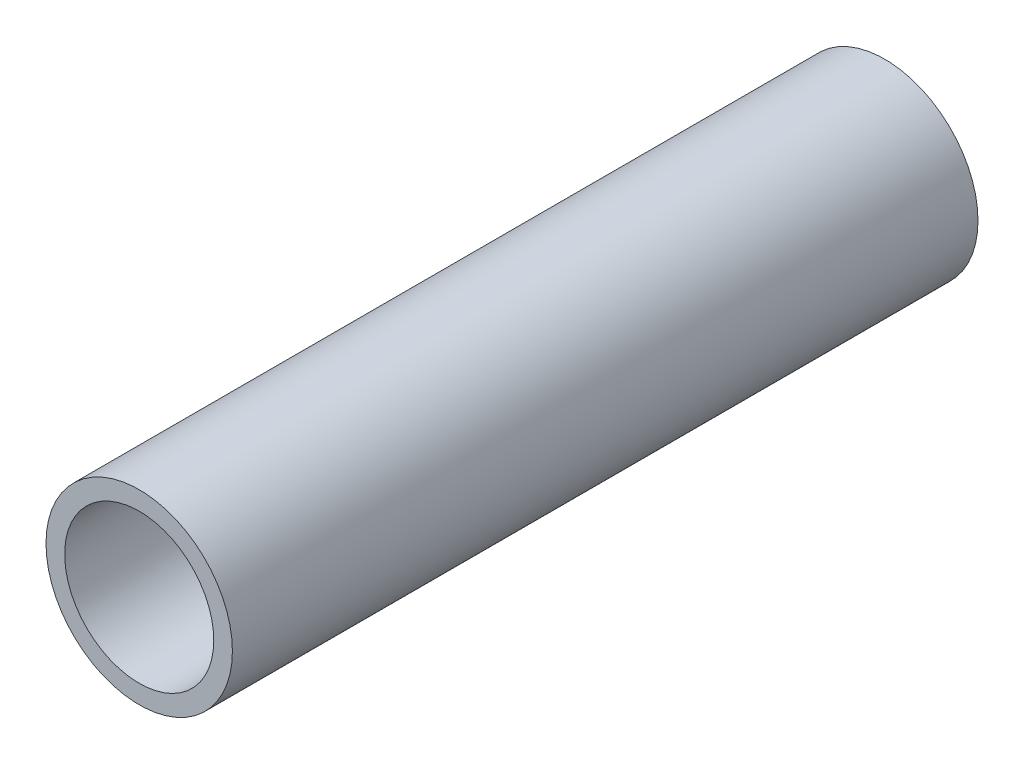
ISO-10303-21;
HEADER;
FILE_DESCRIPTION(('STEP AP214'),'2;1');
FILE_NAME('part.step','',(''),(''),'','','');
FILE_SCHEMA(('AUTOMOTIVE_DESIGN { 1 0 10303 214 1 1 1 1 }'));
ENDSEC;
DATA;
#1=APPLICATION_CONTEXT('core data for automotive mechanical design processes');
#2=APPLICATION_PROTOCOL_DEFINITION('international standard','automotive_design',2000,#1);
#3=PRODUCT_CONTEXT('',#1,'mechanical');
#4=PRODUCT('Part','Part','',(#3));
#5=PRODUCT_RELATED_PRODUCT_CATEGORY('part','',(#4));
#6=PRODUCT_DEFINITION_FORMATION('','',#4);
#7=PRODUCT_DEFINITION_CONTEXT('part definition',#1,'design');
#8=PRODUCT_DEFINITION('design','',#6,#7);
#9=PRODUCT_DEFINITION_SHAPE('','',#8);
#10=(LENGTH_UNIT() NAMED_UNIT(*) SI_UNIT(.MILLI.,.METRE.));
#11=(NAMED_UNIT(*) PLANE_ANGLE_UNIT() SI_UNIT($,.RADIAN.));
#12=(NAMED_UNIT(*) SI_UNIT($,.STERADIAN.) SOLID_ANGLE_UNIT());
#13=UNCERTAINTY_MEASURE_WITH_UNIT(LENGTH_MEASURE(1.E-05),#10,'distance_accuracy_value','');
#14=(GEOMETRIC_REPRESENTATION_CONTEXT(3) GLOBAL_UNCERTAINTY_ASSIGNED_CONTEXT((#13)) GLOBAL_UNIT_ASSIGNED_CONTEXT((#10,
#11,#12)) REPRESENTATION_CONTEXT('',''));
#15=CARTESIAN_POINT('',(0.,0.,0.));
#16=DIRECTION('',(0.,0.,1.));
#17=DIRECTION('',(1.,0.,0.));
#18=AXIS2_PLACEMENT_3D('',#15,#16,#17);
#19=CARTESIAN_POINT('',(0.,0.,508.));
#20=DIRECTION('',(0.,0.,1.));
#21=DIRECTION('',(1.,0.,0.));
#22=AXIS2_PLACEMENT_3D('',#19,#20,#21);
#23=PLANE('',#22);
#24=CARTESIAN_POINT('',(0.,0.,508.));
#25=DIRECTION('',(0.,0.,1.));
#26=DIRECTION('',(1.,0.,0.));
#27=AXIS2_PLACEMENT_3D('',#24,#25,#26);
#28=CIRCLE('',#27,63.5);
#29=CARTESIAN_POINT('',(63.5,0.,508.));
#30=VERTEX_POINT('',#29);
#31=EDGE_CURVE('E10',#30,#30,#28,.T.);
#32=ORIENTED_EDGE('',*,*,#31,.T.);
#33=EDGE_LOOP('',(#32));
#34=FACE_BOUND('',#33,.T.);
#35=CARTESIAN_POINT('',(0.,0.,508.));
#36=DIRECTION('',(0.,0.,1.));
#37=DIRECTION('',(1.,0.,0.));
#38=AXIS2_PLACEMENT_3D('',#35,#36,#37);
#39=CIRCLE('',#38,50.8);
#40=CARTESIAN_POINT('',(50.8,0.,508.));
#41=VERTEX_POINT('',#40);
#42=EDGE_CURVE('E46',#41,#41,#39,.T.);
#43=ORIENTED_EDGE('',*,*,#42,.F.);
#44=EDGE_LOOP('',(#43));
#45=FACE_BOUND('',#44,.T.);
#46=ADVANCED_FACE('F35',(#34,#45),#23,.T.);
#47=CARTESIAN_POINT('',(0.,0.,0.));
#48=DIRECTION('',(0.,0.,1.));
#49=DIRECTION('',(1.,0.,0.));
#50=AXIS2_PLACEMENT_3D('',#47,#48,#49);
#51=PLANE('',#50);
#52=CARTESIAN_POINT('',(0.,0.,0.));
#53=DIRECTION('',(0.,0.,1.));
#54=DIRECTION('',(1.,0.,0.));
#55=AXIS2_PLACEMENT_3D('',#52,#53,#54);
#56=CIRCLE('',#55,63.5);
#57=CARTESIAN_POINT('',(63.5,0.,0.));
#58=VERTEX_POINT('',#57);
#59=EDGE_CURVE('E39',#58,#58,#56,.T.);
#60=ORIENTED_EDGE('',*,*,#59,.F.);
#61=EDGE_LOOP('',(#60));
#62=FACE_BOUND('',#61,.T.);
#63=CARTESIAN_POINT('',(0.,0.,0.));
#64=DIRECTION('',(0.,0.,1.));
#65=DIRECTION('',(1.,0.,0.));
#66=AXIS2_PLACEMENT_3D('',#63,#64,#65);
#67=CIRCLE('',#66,50.8);
#68=CARTESIAN_POINT('',(50.8,0.,0.));
#69=VERTEX_POINT('',#68);
#70=EDGE_CURVE('E48',#69,#69,#67,.T.);
#71=ORIENTED_EDGE('',*,*,#70,.T.);
#72=EDGE_LOOP('',(#71));
#73=FACE_BOUND('',#72,.T.);
#74=ADVANCED_FACE('F58',(#62,#73),#51,.F.);
#75=CARTESIAN_POINT('',(0.,0.,508.));
#76=DIRECTION('',(0.,0.,-1.));
#77=DIRECTION('',(-1.,0.,0.));
#78=AXIS2_PLACEMENT_3D('',#75,#76,#77);
#79=CYLINDRICAL_SURFACE('',#78,63.5);
#80=ORIENTED_EDGE('',*,*,#31,.F.);
#81=EDGE_LOOP('',(#80));
#82=FACE_BOUND('',#81,.T.);
#83=ORIENTED_EDGE('',*,*,#59,.T.);
#84=EDGE_LOOP('',(#83));
#85=FACE_BOUND('',#84,.T.);
#86=ADVANCED_FACE('F37',(#82,#85),#79,.T.);
#87=CARTESIAN_POINT('',(0.,0.,508.));
#88=DIRECTION('',(0.,0.,-1.));
#89=DIRECTION('',(-1.,0.,0.));
#90=AXIS2_PLACEMENT_3D('',#87,#88,#89);
#91=CYLINDRICAL_SURFACE('',#90,50.8);
#92=ORIENTED_EDGE('',*,*,#42,.T.);
#93=EDGE_LOOP('',(#92));
#94=FACE_BOUND('',#93,.T.);
#95=ORIENTED_EDGE('',*,*,#70,.F.);
#96=EDGE_LOOP('',(#95));
#97=FACE_BOUND('',#96,.T.);
#98=ADVANCED_FACE('F54',(#94,#97),#91,.F.);
#99=CLOSED_SHELL('',(#46,#74,#86,#98));
#100=MANIFOLD_SOLID_BREP('B2',#99);
#101=ADVANCED_BREP_SHAPE_REPRESENTATION('',(#18,#100),#14);
#102=SHAPE_DEFINITION_REPRESENTATION(#9,#101);
ENDSEC;
END-ISO-10303-21;
